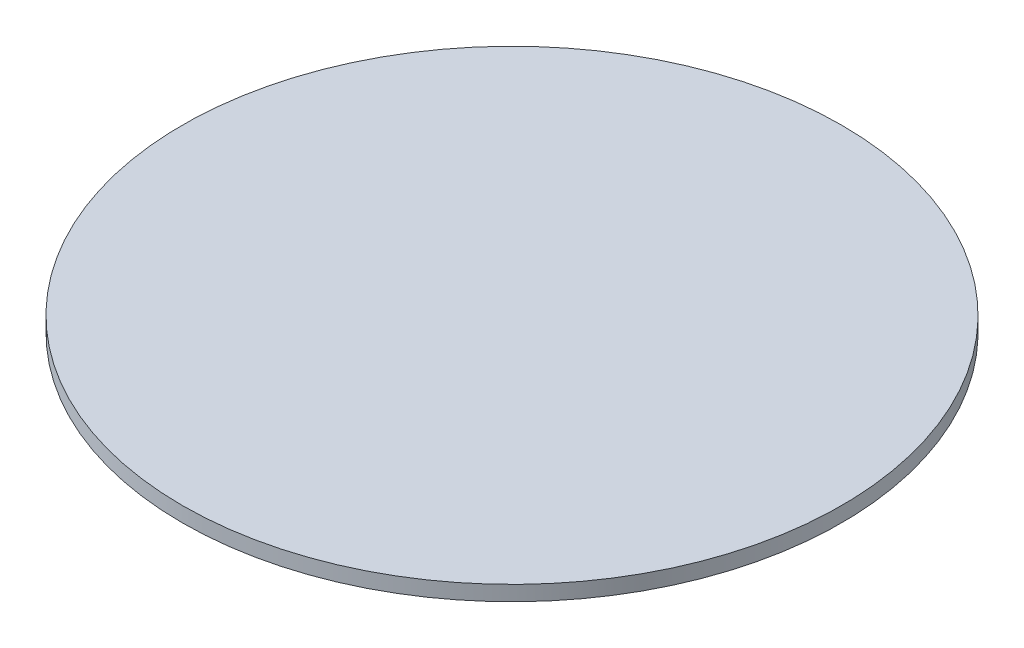
ISO-10303-21;
HEADER;
FILE_DESCRIPTION(('STEP AP214'),'2;1');
FILE_NAME('part.step','',(''),(''),'','','');
FILE_SCHEMA(('AUTOMOTIVE_DESIGN { 1 0 10303 214 1 1 1 1 }'));
ENDSEC;
DATA;
#1=APPLICATION_CONTEXT('core data for automotive mechanical design processes');
#2=APPLICATION_PROTOCOL_DEFINITION('international standard','automotive_design',2000,#1);
#3=PRODUCT_CONTEXT('',#1,'mechanical');
#4=PRODUCT('Part','Part','',(#3));
#5=PRODUCT_RELATED_PRODUCT_CATEGORY('part','',(#4));
#6=PRODUCT_DEFINITION_FORMATION('','',#4);
#7=PRODUCT_DEFINITION_CONTEXT('part definition',#1,'design');
#8=PRODUCT_DEFINITION('design','',#6,#7);
#9=PRODUCT_DEFINITION_SHAPE('','',#8);
#10=(LENGTH_UNIT() NAMED_UNIT(*) SI_UNIT(.MILLI.,.METRE.));
#11=(NAMED_UNIT(*) PLANE_ANGLE_UNIT() SI_UNIT($,.RADIAN.));
#12=(NAMED_UNIT(*) SI_UNIT($,.STERADIAN.) SOLID_ANGLE_UNIT());
#13=UNCERTAINTY_MEASURE_WITH_UNIT(LENGTH_MEASURE(1.E-05),#10,'distance_accuracy_value','');
#14=(GEOMETRIC_REPRESENTATION_CONTEXT(3) GLOBAL_UNCERTAINTY_ASSIGNED_CONTEXT((#13)) GLOBAL_UNIT_ASSIGNED_CONTEXT((#10,
#11,#12)) REPRESENTATION_CONTEXT('',''));
#15=CARTESIAN_POINT('',(0.,0.,0.));
#16=DIRECTION('',(0.,0.,1.));
#17=DIRECTION('',(1.,0.,0.));
#18=AXIS2_PLACEMENT_3D('',#15,#16,#17);
#19=CARTESIAN_POINT('',(0.,2.54,0.));
#20=DIRECTION('',(0.,-1.,0.));
#21=DIRECTION('',(0.,0.,-1.));
#22=AXIS2_PLACEMENT_3D('',#19,#20,#21);
#23=CYLINDRICAL_SURFACE('',#22,55.6628355875093);
#24=CARTESIAN_POINT('',(0.,2.54,0.));
#25=DIRECTION('',(0.,1.,0.));
#26=DIRECTION('',(0.,0.,1.));
#27=AXIS2_PLACEMENT_3D('',#24,#25,#26);
#28=CIRCLE('',#27,55.6628355875093);
#29=CARTESIAN_POINT('',(0.,2.54,55.6628355875093));
#30=VERTEX_POINT('',#29);
#31=EDGE_CURVE('E10',#30,#30,#28,.T.);
#32=ORIENTED_EDGE('',*,*,#31,.F.);
#33=EDGE_LOOP('',(#32));
#34=FACE_BOUND('',#33,.T.);
#35=CARTESIAN_POINT('',(0.,0.,0.));
#36=DIRECTION('',(0.,1.,0.));
#37=DIRECTION('',(0.,0.,1.));
#38=AXIS2_PLACEMENT_3D('',#35,#36,#37);
#39=CIRCLE('',#38,55.6628355875093);
#40=CARTESIAN_POINT('',(0.,0.,55.6628355875093));
#41=VERTEX_POINT('',#40);
#42=EDGE_CURVE('E36',#41,#41,#39,.T.);
#43=ORIENTED_EDGE('',*,*,#42,.T.);
#44=EDGE_LOOP('',(#43));
#45=FACE_BOUND('',#44,.T.);
#46=ADVANCED_FACE('F33',(#34,#45),#23,.T.);
#47=CARTESIAN_POINT('',(0.,2.54,0.));
#48=DIRECTION('',(0.,1.,0.));
#49=DIRECTION('',(0.,0.,1.));
#50=AXIS2_PLACEMENT_3D('',#47,#48,#49);
#51=PLANE('',#50);
#52=ORIENTED_EDGE('',*,*,#31,.T.);
#53=EDGE_LOOP('',(#52));
#54=FACE_BOUND('',#53,.T.);
#55=ADVANCED_FACE('F48',(#54),#51,.T.);
#56=CARTESIAN_POINT('',(0.,0.,0.));
#57=DIRECTION('',(0.,1.,0.));
#58=DIRECTION('',(0.,0.,1.));
#59=AXIS2_PLACEMENT_3D('',#56,#57,#58);
#60=PLANE('',#59);
#61=ORIENTED_EDGE('',*,*,#42,.F.);
#62=EDGE_LOOP('',(#61));
#63=FACE_BOUND('',#62,.T.);
#64=ADVANCED_FACE('F46',(#63),#60,.F.);
#65=CLOSED_SHELL('',(#46,#55,#64));
#66=MANIFOLD_SOLID_BREP('B2',#65);
#67=ADVANCED_BREP_SHAPE_REPRESENTATION('',(#18,#66),#14);
#68=SHAPE_DEFINITION_REPRESENTATION(#9,#67);
ENDSEC;
END-ISO-10303-21;
